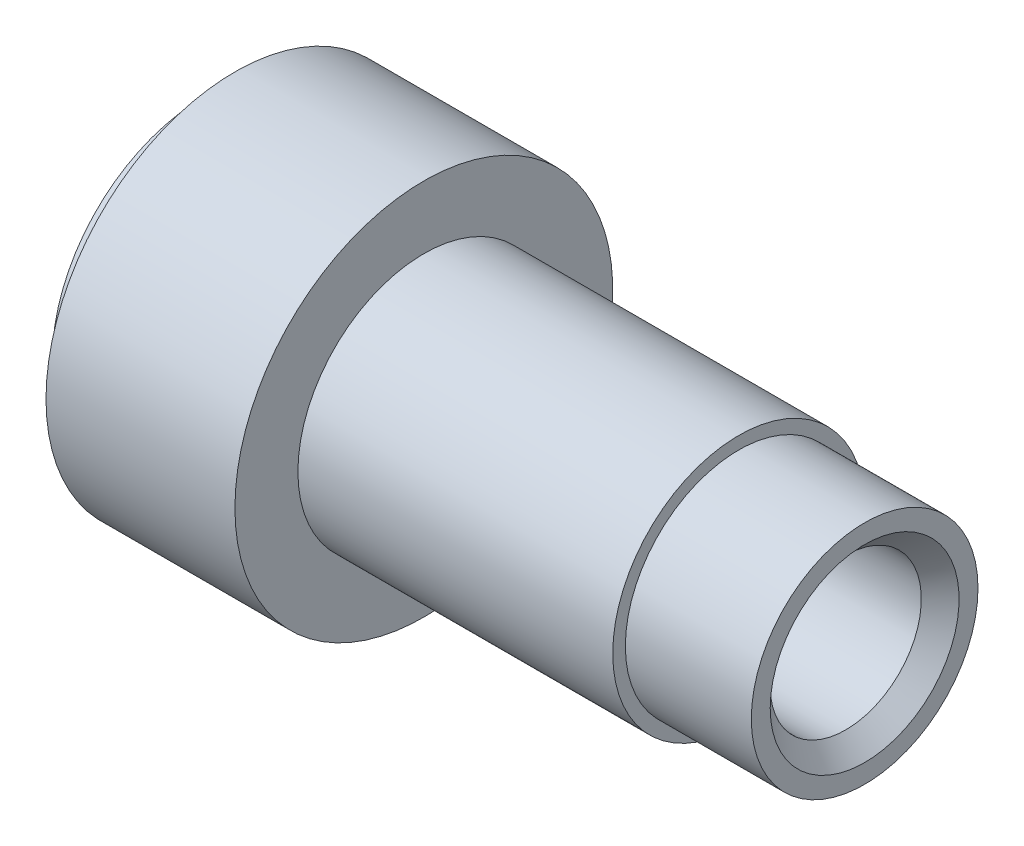
ISO-10303-21;
HEADER;
FILE_DESCRIPTION(('STEP AP214'),'2;1');
FILE_NAME('part.step','',(''),(''),'','','');
FILE_SCHEMA(('AUTOMOTIVE_DESIGN { 1 0 10303 214 1 1 1 1 }'));
ENDSEC;
DATA;
#1=APPLICATION_CONTEXT('core data for automotive mechanical design processes');
#2=APPLICATION_PROTOCOL_DEFINITION('international standard','automotive_design',2000,#1);
#3=PRODUCT_CONTEXT('',#1,'mechanical');
#4=PRODUCT('Part','Part','',(#3));
#5=PRODUCT_RELATED_PRODUCT_CATEGORY('part','',(#4));
#6=PRODUCT_DEFINITION_FORMATION('','',#4);
#7=PRODUCT_DEFINITION_CONTEXT('part definition',#1,'design');
#8=PRODUCT_DEFINITION('design','',#6,#7);
#9=PRODUCT_DEFINITION_SHAPE('','',#8);
#10=(LENGTH_UNIT() NAMED_UNIT(*) SI_UNIT(.MILLI.,.METRE.));
#11=(NAMED_UNIT(*) PLANE_ANGLE_UNIT() SI_UNIT($,.RADIAN.));
#12=(NAMED_UNIT(*) SI_UNIT($,.STERADIAN.) SOLID_ANGLE_UNIT());
#13=UNCERTAINTY_MEASURE_WITH_UNIT(LENGTH_MEASURE(1.E-05),#10,'distance_accuracy_value','');
#14=(GEOMETRIC_REPRESENTATION_CONTEXT(3) GLOBAL_UNCERTAINTY_ASSIGNED_CONTEXT((#13)) GLOBAL_UNIT_ASSIGNED_CONTEXT((#10,
#11,#12)) REPRESENTATION_CONTEXT('',''));
#15=CARTESIAN_POINT('',(0.,0.,0.));
#16=DIRECTION('',(0.,0.,1.));
#17=DIRECTION('',(1.,0.,0.));
#18=AXIS2_PLACEMENT_3D('',#15,#16,#17);
#19=CARTESIAN_POINT('',(3.48213494224021,-24.,0.));
#20=DIRECTION('',(-1.,0.,0.));
#21=DIRECTION('',(0.,0.,1.));
#22=AXIS2_PLACEMENT_3D('',#19,#20,#21);
#23=PLANE('',#22);
#24=CARTESIAN_POINT('',(3.48213494224021,0.,0.));
#25=DIRECTION('',(-1.,0.,0.));
#26=DIRECTION('',(0.,0.,1.));
#27=AXIS2_PLACEMENT_3D('',#24,#25,#26);
#28=CIRCLE('',#27,24.);
#29=CARTESIAN_POINT('',(3.48213494224021,0.,24.));
#30=VERTEX_POINT('',#29);
#31=EDGE_CURVE('E100',#30,#30,#28,.T.);
#32=ORIENTED_EDGE('',*,*,#31,.T.);
#33=EDGE_LOOP('',(#32));
#34=FACE_BOUND('',#33,.T.);
#35=CARTESIAN_POINT('',(3.48213494224021,0.,0.));
#36=DIRECTION('',(-1.,0.,0.));
#37=DIRECTION('',(0.,0.,1.));
#38=AXIS2_PLACEMENT_3D('',#35,#36,#37);
#39=CIRCLE('',#38,20.);
#40=CARTESIAN_POINT('',(3.48213494224021,0.,20.));
#41=VERTEX_POINT('',#40);
#42=EDGE_CURVE('E10',#41,#41,#39,.T.);
#43=ORIENTED_EDGE('',*,*,#42,.F.);
#44=EDGE_LOOP('',(#43));
#45=FACE_BOUND('',#44,.T.);
#46=ADVANCED_FACE('F37',(#34,#45),#23,.T.);
#47=CARTESIAN_POINT('',(0.,0.,0.));
#48=DIRECTION('',(-1.,0.,0.));
#49=DIRECTION('',(0.,0.,1.));
#50=AXIS2_PLACEMENT_3D('',#47,#48,#49);
#51=CYLINDRICAL_SURFACE('',#50,20.);
#52=ORIENTED_EDGE('',*,*,#42,.T.);
#53=EDGE_LOOP('',(#52));
#54=FACE_BOUND('',#53,.T.);
#55=CARTESIAN_POINT('',(13.4821349422402,0.,0.));
#56=DIRECTION('',(-1.,0.,0.));
#57=DIRECTION('',(0.,0.,1.));
#58=AXIS2_PLACEMENT_3D('',#55,#56,#57);
#59=CIRCLE('',#58,20.);
#60=CARTESIAN_POINT('',(13.4821349422402,0.,20.));
#61=VERTEX_POINT('',#60);
#62=EDGE_CURVE('E44',#61,#61,#59,.T.);
#63=ORIENTED_EDGE('',*,*,#62,.F.);
#64=EDGE_LOOP('',(#63));
#65=FACE_BOUND('',#64,.T.);
#66=ADVANCED_FACE('F119',(#54,#65),#51,.F.);
#67=CARTESIAN_POINT('',(13.4821349422402,-20.,0.));
#68=DIRECTION('',(-1.,0.,0.));
#69=DIRECTION('',(0.,0.,1.));
#70=AXIS2_PLACEMENT_3D('',#67,#68,#69);
#71=PLANE('',#70);
#72=ORIENTED_EDGE('',*,*,#62,.T.);
#73=EDGE_LOOP('',(#72));
#74=FACE_BOUND('',#73,.T.);
#75=CARTESIAN_POINT('',(13.4821349422402,0.,0.));
#76=DIRECTION('',(-1.,0.,0.));
#77=DIRECTION('',(0.,0.,1.));
#78=AXIS2_PLACEMENT_3D('',#75,#76,#77);
#79=CIRCLE('',#78,18.);
#80=CARTESIAN_POINT('',(13.4821349422402,0.,18.));
#81=VERTEX_POINT('',#80);
#82=EDGE_CURVE('E49',#81,#81,#79,.T.);
#83=ORIENTED_EDGE('',*,*,#82,.F.);
#84=EDGE_LOOP('',(#83));
#85=FACE_BOUND('',#84,.T.);
#86=ADVANCED_FACE('F123',(#74,#85),#71,.T.);
#87=CARTESIAN_POINT('',(0.,0.,0.));
#88=DIRECTION('',(-1.,0.,0.));
#89=DIRECTION('',(0.,0.,1.));
#90=AXIS2_PLACEMENT_3D('',#87,#88,#89);
#91=CYLINDRICAL_SURFACE('',#90,18.);
#92=ORIENTED_EDGE('',*,*,#82,.T.);
#93=EDGE_LOOP('',(#92));
#94=FACE_BOUND('',#93,.T.);
#95=CARTESIAN_POINT('',(33.4821349422402,0.,0.));
#96=DIRECTION('',(-1.,0.,0.));
#97=DIRECTION('',(0.,0.,1.));
#98=AXIS2_PLACEMENT_3D('',#95,#96,#97);
#99=CIRCLE('',#98,18.);
#100=CARTESIAN_POINT('',(33.4821349422402,0.,18.));
#101=VERTEX_POINT('',#100);
#102=EDGE_CURVE('E54',#101,#101,#99,.T.);
#103=ORIENTED_EDGE('',*,*,#102,.F.);
#104=EDGE_LOOP('',(#103));
#105=FACE_BOUND('',#104,.T.);
#106=ADVANCED_FACE('F127',(#94,#105),#91,.F.);
#107=CARTESIAN_POINT('',(33.4821349422402,-18.,0.));
#108=DIRECTION('',(-1.,0.,0.));
#109=DIRECTION('',(0.,0.,1.));
#110=AXIS2_PLACEMENT_3D('',#107,#108,#109);
#111=PLANE('',#110);
#112=ORIENTED_EDGE('',*,*,#102,.T.);
#113=EDGE_LOOP('',(#112));
#114=FACE_BOUND('',#113,.T.);
#115=CARTESIAN_POINT('',(33.4821349422402,0.,0.));
#116=DIRECTION('',(-1.,0.,0.));
#117=DIRECTION('',(0.,0.,1.));
#118=AXIS2_PLACEMENT_3D('',#115,#116,#117);
#119=CIRCLE('',#118,12.);
#120=CARTESIAN_POINT('',(33.4821349422402,0.,12.));
#121=VERTEX_POINT('',#120);
#122=EDGE_CURVE('E60',#121,#121,#119,.T.);
#123=ORIENTED_EDGE('',*,*,#122,.F.);
#124=EDGE_LOOP('',(#123));
#125=FACE_BOUND('',#124,.T.);
#126=ADVANCED_FACE('F133',(#114,#125),#111,.T.);
#127=CARTESIAN_POINT('',(0.,0.,0.));
#128=DIRECTION('',(-1.,0.,0.));
#129=DIRECTION('',(0.,0.,1.));
#130=AXIS2_PLACEMENT_3D('',#127,#128,#129);
#131=CYLINDRICAL_SURFACE('',#130,12.);
#132=ORIENTED_EDGE('',*,*,#122,.T.);
#133=EDGE_LOOP('',(#132));
#134=FACE_BOUND('',#133,.T.);
#135=CARTESIAN_POINT('',(105.48213494224,0.,0.));
#136=DIRECTION('',(-1.,0.,0.));
#137=DIRECTION('',(0.,0.,1.));
#138=AXIS2_PLACEMENT_3D('',#135,#136,#137);
#139=CIRCLE('',#138,12.);
#140=CARTESIAN_POINT('',(105.48213494224,0.,12.));
#141=VERTEX_POINT('',#140);
#142=EDGE_CURVE('E64',#141,#141,#139,.T.);
#143=ORIENTED_EDGE('',*,*,#142,.F.);
#144=EDGE_LOOP('',(#143));
#145=FACE_BOUND('',#144,.T.);
#146=ADVANCED_FACE('F137',(#134,#145),#131,.F.);
#147=CARTESIAN_POINT('',(108.48213494224,0.,0.));
#148=DIRECTION('',(1.,0.,0.));
#149=DIRECTION('',(0.,0.,-1.));
#150=AXIS2_PLACEMENT_3D('',#147,#148,#149);
#151=CONICAL_SURFACE('',#150,15.,0.785398163397448);
#152=ORIENTED_EDGE('',*,*,#142,.T.);
#153=EDGE_LOOP('',(#152));
#154=FACE_BOUND('',#153,.T.);
#155=CARTESIAN_POINT('',(108.48213494224,0.,0.));
#156=DIRECTION('',(-1.,0.,0.));
#157=DIRECTION('',(0.,0.,1.));
#158=AXIS2_PLACEMENT_3D('',#155,#156,#157);
#159=CIRCLE('',#158,15.);
#160=CARTESIAN_POINT('',(108.48213494224,0.,15.));
#161=VERTEX_POINT('',#160);
#162=EDGE_CURVE('E68',#161,#161,#159,.T.);
#163=ORIENTED_EDGE('',*,*,#162,.F.);
#164=EDGE_LOOP('',(#163));
#165=FACE_BOUND('',#164,.T.);
#166=ADVANCED_FACE('F141',(#154,#165),#151,.F.);
#167=CARTESIAN_POINT('',(108.48213494224,-15.,0.));
#168=DIRECTION('',(1.,0.,0.));
#169=DIRECTION('',(0.,0.,-1.));
#170=AXIS2_PLACEMENT_3D('',#167,#168,#169);
#171=PLANE('',#170);
#172=ORIENTED_EDGE('',*,*,#162,.T.);
#173=EDGE_LOOP('',(#172));
#174=FACE_BOUND('',#173,.T.);
#175=CARTESIAN_POINT('',(108.48213494224,0.,0.));
#176=DIRECTION('',(-1.,0.,0.));
#177=DIRECTION('',(0.,0.,1.));
#178=AXIS2_PLACEMENT_3D('',#175,#176,#177);
#179=CIRCLE('',#178,18.);
#180=CARTESIAN_POINT('',(108.48213494224,0.,18.));
#181=VERTEX_POINT('',#180);
#182=EDGE_CURVE('E72',#181,#181,#179,.T.);
#183=ORIENTED_EDGE('',*,*,#182,.F.);
#184=EDGE_LOOP('',(#183));
#185=FACE_BOUND('',#184,.T.);
#186=ADVANCED_FACE('F145',(#174,#185),#171,.T.);
#187=CARTESIAN_POINT('',(0.,0.,0.));
#188=DIRECTION('',(-1.,0.,0.));
#189=DIRECTION('',(0.,0.,1.));
#190=AXIS2_PLACEMENT_3D('',#187,#188,#189);
#191=CYLINDRICAL_SURFACE('',#190,18.);
#192=ORIENTED_EDGE('',*,*,#182,.T.);
#193=EDGE_LOOP('',(#192));
#194=FACE_BOUND('',#193,.T.);
#195=CARTESIAN_POINT('',(88.4821349422402,0.,0.));
#196=DIRECTION('',(-1.,0.,0.));
#197=DIRECTION('',(0.,0.,1.));
#198=AXIS2_PLACEMENT_3D('',#195,#196,#197);
#199=CIRCLE('',#198,18.);
#200=CARTESIAN_POINT('',(88.4821349422402,0.,18.));
#201=VERTEX_POINT('',#200);
#202=EDGE_CURVE('E76',#201,#201,#199,.T.);
#203=ORIENTED_EDGE('',*,*,#202,.F.);
#204=EDGE_LOOP('',(#203));
#205=FACE_BOUND('',#204,.T.);
#206=ADVANCED_FACE('F149',(#194,#205),#191,.T.);
#207=CARTESIAN_POINT('',(88.4821349422402,-18.,0.));
#208=DIRECTION('',(1.,0.,0.));
#209=DIRECTION('',(0.,0.,-1.));
#210=AXIS2_PLACEMENT_3D('',#207,#208,#209);
#211=PLANE('',#210);
#212=ORIENTED_EDGE('',*,*,#202,.T.);
#213=EDGE_LOOP('',(#212));
#214=FACE_BOUND('',#213,.T.);
#215=CARTESIAN_POINT('',(88.4821349422402,0.,0.));
#216=DIRECTION('',(-1.,0.,0.));
#217=DIRECTION('',(0.,0.,1.));
#218=AXIS2_PLACEMENT_3D('',#215,#216,#217);
#219=CIRCLE('',#218,20.);
#220=CARTESIAN_POINT('',(88.4821349422402,0.,20.));
#221=VERTEX_POINT('',#220);
#222=EDGE_CURVE('E80',#221,#221,#219,.T.);
#223=ORIENTED_EDGE('',*,*,#222,.F.);
#224=EDGE_LOOP('',(#223));
#225=FACE_BOUND('',#224,.T.);
#226=ADVANCED_FACE('F153',(#214,#225),#211,.T.);
#227=CARTESIAN_POINT('',(0.,0.,0.));
#228=DIRECTION('',(-1.,0.,0.));
#229=DIRECTION('',(0.,0.,1.));
#230=AXIS2_PLACEMENT_3D('',#227,#228,#229);
#231=CYLINDRICAL_SURFACE('',#230,20.);
#232=ORIENTED_EDGE('',*,*,#222,.T.);
#233=EDGE_LOOP('',(#232));
#234=FACE_BOUND('',#233,.T.);
#235=CARTESIAN_POINT('',(38.4821349422402,0.,0.));
#236=DIRECTION('',(-1.,0.,0.));
#237=DIRECTION('',(0.,0.,1.));
#238=AXIS2_PLACEMENT_3D('',#235,#236,#237);
#239=CIRCLE('',#238,20.);
#240=CARTESIAN_POINT('',(38.4821349422402,0.,20.));
#241=VERTEX_POINT('',#240);
#242=EDGE_CURVE('E84',#241,#241,#239,.T.);
#243=ORIENTED_EDGE('',*,*,#242,.F.);
#244=EDGE_LOOP('',(#243));
#245=FACE_BOUND('',#244,.T.);
#246=ADVANCED_FACE('F157',(#234,#245),#231,.T.);
#247=CARTESIAN_POINT('',(38.4821349422402,-20.,0.));
#248=DIRECTION('',(1.,0.,0.));
#249=DIRECTION('',(0.,0.,-1.));
#250=AXIS2_PLACEMENT_3D('',#247,#248,#249);
#251=PLANE('',#250);
#252=ORIENTED_EDGE('',*,*,#242,.T.);
#253=EDGE_LOOP('',(#252));
#254=FACE_BOUND('',#253,.T.);
#255=CARTESIAN_POINT('',(38.4821349422402,0.,0.));
#256=DIRECTION('',(-1.,0.,0.));
#257=DIRECTION('',(0.,0.,1.));
#258=AXIS2_PLACEMENT_3D('',#255,#256,#257);
#259=CIRCLE('',#258,30.);
#260=CARTESIAN_POINT('',(38.4821349422402,0.,30.));
#261=VERTEX_POINT('',#260);
#262=EDGE_CURVE('E88',#261,#261,#259,.T.);
#263=ORIENTED_EDGE('',*,*,#262,.F.);
#264=EDGE_LOOP('',(#263));
#265=FACE_BOUND('',#264,.T.);
#266=ADVANCED_FACE('F161',(#254,#265),#251,.T.);
#267=CARTESIAN_POINT('',(0.,0.,0.));
#268=DIRECTION('',(-1.,0.,0.));
#269=DIRECTION('',(0.,0.,1.));
#270=AXIS2_PLACEMENT_3D('',#267,#268,#269);
#271=CYLINDRICAL_SURFACE('',#270,30.);
#272=ORIENTED_EDGE('',*,*,#262,.T.);
#273=EDGE_LOOP('',(#272));
#274=FACE_BOUND('',#273,.T.);
#275=CARTESIAN_POINT('',(8.48213494224021,0.,0.));
#276=DIRECTION('',(-1.,0.,0.));
#277=DIRECTION('',(0.,0.,1.));
#278=AXIS2_PLACEMENT_3D('',#275,#276,#277);
#279=CIRCLE('',#278,30.);
#280=CARTESIAN_POINT('',(8.48213494224021,0.,30.));
#281=VERTEX_POINT('',#280);
#282=EDGE_CURVE('E92',#281,#281,#279,.T.);
#283=ORIENTED_EDGE('',*,*,#282,.F.);
#284=EDGE_LOOP('',(#283));
#285=FACE_BOUND('',#284,.T.);
#286=ADVANCED_FACE('F115',(#274,#285),#271,.T.);
#287=CARTESIAN_POINT('',(8.48213494224021,-30.,0.));
#288=DIRECTION('',(-1.,0.,0.));
#289=DIRECTION('',(0.,0.,1.));
#290=AXIS2_PLACEMENT_3D('',#287,#288,#289);
#291=PLANE('',#290);
#292=ORIENTED_EDGE('',*,*,#282,.T.);
#293=EDGE_LOOP('',(#292));
#294=FACE_BOUND('',#293,.T.);
#295=CARTESIAN_POINT('',(8.48213494224021,0.,0.));
#296=DIRECTION('',(-1.,0.,0.));
#297=DIRECTION('',(0.,0.,1.));
#298=AXIS2_PLACEMENT_3D('',#295,#296,#297);
#299=CIRCLE('',#298,24.);
#300=CARTESIAN_POINT('',(8.48213494224021,0.,24.));
#301=VERTEX_POINT('',#300);
#302=EDGE_CURVE('E96',#301,#301,#299,.T.);
#303=ORIENTED_EDGE('',*,*,#302,.F.);
#304=EDGE_LOOP('',(#303));
#305=FACE_BOUND('',#304,.T.);
#306=ADVANCED_FACE('F109',(#294,#305),#291,.T.);
#307=CARTESIAN_POINT('',(0.,0.,0.));
#308=DIRECTION('',(-1.,0.,0.));
#309=DIRECTION('',(0.,0.,1.));
#310=AXIS2_PLACEMENT_3D('',#307,#308,#309);
#311=CYLINDRICAL_SURFACE('',#310,24.);
#312=ORIENTED_EDGE('',*,*,#302,.T.);
#313=EDGE_LOOP('',(#312));
#314=FACE_BOUND('',#313,.T.);
#315=ORIENTED_EDGE('',*,*,#31,.F.);
#316=EDGE_LOOP('',(#315));
#317=FACE_BOUND('',#316,.T.);
#318=ADVANCED_FACE('F107',(#314,#317),#311,.T.);
#319=CLOSED_SHELL('',(#46,#66,#86,#106,#126,#146,#166,#186,#206,#226,#246,#266,#286,#306,#318));
#320=MANIFOLD_SOLID_BREP('B2',#319);
#321=ADVANCED_BREP_SHAPE_REPRESENTATION('',(#18,#320),#14);
#322=SHAPE_DEFINITION_REPRESENTATION(#9,#321);
ENDSEC;
END-ISO-10303-21;
